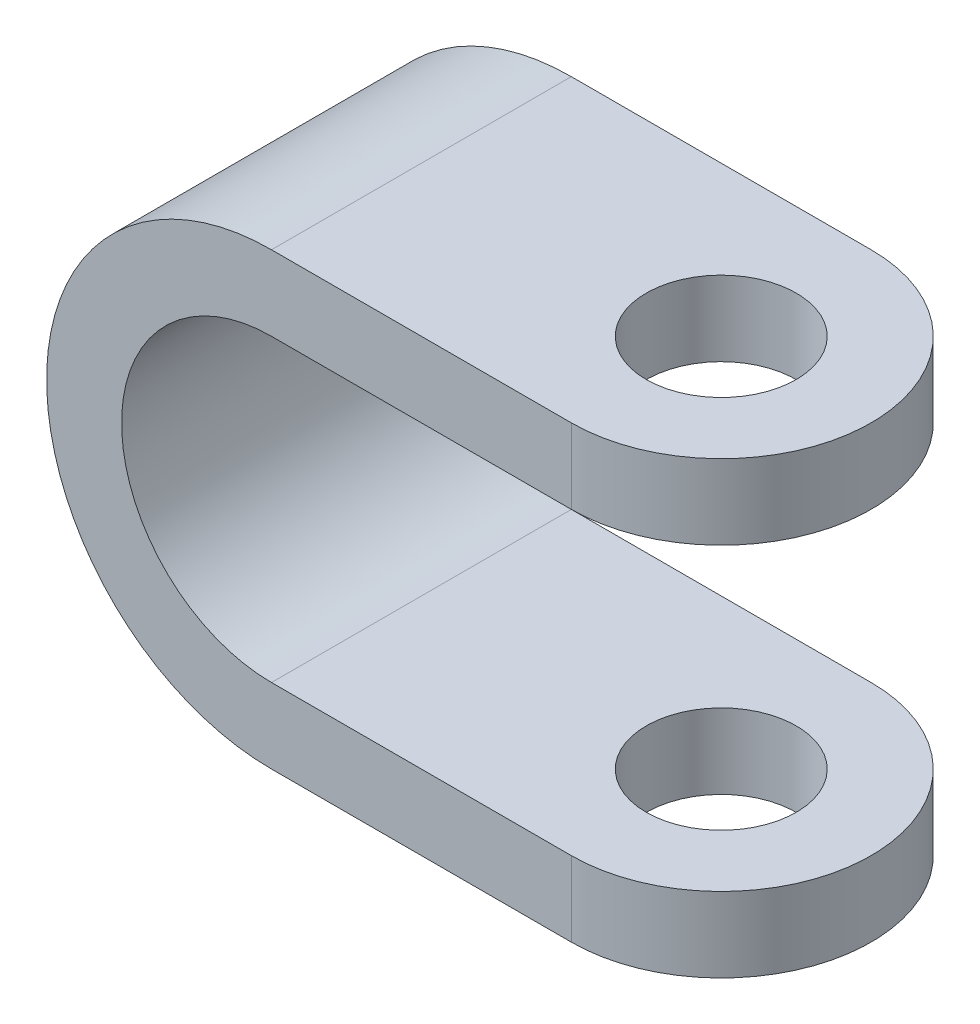
ISO-10303-21;
HEADER;
FILE_DESCRIPTION(('STEP AP214'),'2;1');
FILE_NAME('part.step','',(''),(''),'','','');
FILE_SCHEMA(('AUTOMOTIVE_DESIGN { 1 0 10303 214 1 1 1 1 }'));
ENDSEC;
DATA;
#1=APPLICATION_CONTEXT('core data for automotive mechanical design processes');
#2=APPLICATION_PROTOCOL_DEFINITION('international standard','automotive_design',2000,#1);
#3=PRODUCT_CONTEXT('',#1,'mechanical');
#4=PRODUCT('Part','Part','',(#3));
#5=PRODUCT_RELATED_PRODUCT_CATEGORY('part','',(#4));
#6=PRODUCT_DEFINITION_FORMATION('','',#4);
#7=PRODUCT_DEFINITION_CONTEXT('part definition',#1,'design');
#8=PRODUCT_DEFINITION('design','',#6,#7);
#9=PRODUCT_DEFINITION_SHAPE('','',#8);
#10=(LENGTH_UNIT() NAMED_UNIT(*) SI_UNIT(.MILLI.,.METRE.));
#11=(NAMED_UNIT(*) PLANE_ANGLE_UNIT() SI_UNIT($,.RADIAN.));
#12=(NAMED_UNIT(*) SI_UNIT($,.STERADIAN.) SOLID_ANGLE_UNIT());
#13=UNCERTAINTY_MEASURE_WITH_UNIT(LENGTH_MEASURE(1.E-05),#10,'distance_accuracy_value','');
#14=(GEOMETRIC_REPRESENTATION_CONTEXT(3) GLOBAL_UNCERTAINTY_ASSIGNED_CONTEXT((#13)) GLOBAL_UNIT_ASSIGNED_CONTEXT((#10,
#11,#12)) REPRESENTATION_CONTEXT('',''));
#15=CARTESIAN_POINT('',(0.,0.,0.));
#16=DIRECTION('',(0.,0.,1.));
#17=DIRECTION('',(1.,0.,0.));
#18=AXIS2_PLACEMENT_3D('',#15,#16,#17);
#19=CARTESIAN_POINT('',(-20.,-90.,45.));
#20=DIRECTION('',(0.,1.,0.));
#21=DIRECTION('',(0.,0.,1.));
#22=AXIS2_PLACEMENT_3D('',#19,#20,#21);
#23=CYLINDRICAL_SURFACE('',#22,10.);
#24=CARTESIAN_POINT('',(-20.,-15.,45.));
#25=DIRECTION('',(0.,-1.,0.));
#26=DIRECTION('',(1.,0.,0.));
#27=AXIS2_PLACEMENT_3D('',#24,#25,#26);
#28=CIRCLE('',#27,10.);
#29=CARTESIAN_POINT('',(-20.,-15.,55.));
#30=VERTEX_POINT('',#29);
#31=EDGE_CURVE('E178',#30,#30,#28,.F.);
#32=CARTESIAN_POINT('',(-20.,-5.00000000000002,45.));
#33=DIRECTION('',(0.,-1.,0.));
#34=DIRECTION('',(1.,0.,0.));
#35=AXIS2_PLACEMENT_3D('',#32,#33,#34);
#36=CIRCLE('',#35,10.);
#37=CARTESIAN_POINT('',(-20.,-5.00000000000002,55.));
#38=VERTEX_POINT('',#37);
#39=EDGE_CURVE('E118',#38,#38,#36,.F.);
#40=CARTESIAN_POINT('',(-20.,-15.,55.));
#41=CARTESIAN_POINT('',(-20.,-14.8958333333333,55.));
#42=CARTESIAN_POINT('',(-20.,-14.7916666666667,55.));
#43=CARTESIAN_POINT('',(-20.,-14.5833333333333,55.));
#44=CARTESIAN_POINT('',(-20.,-14.4791666666667,55.));
#45=CARTESIAN_POINT('',(-20.,-14.2708333333333,55.));
#46=CARTESIAN_POINT('',(-20.,-14.1666666666667,55.));
#47=CARTESIAN_POINT('',(-20.,-13.9583333333333,55.));
#48=CARTESIAN_POINT('',(-20.,-13.8541666666667,55.));
#49=CARTESIAN_POINT('',(-20.,-13.6458333333333,55.));
#50=CARTESIAN_POINT('',(-20.,-13.5416666666667,55.));
#51=CARTESIAN_POINT('',(-20.,-13.3333333333333,55.));
#52=CARTESIAN_POINT('',(-20.,-13.2291666666667,55.));
#53=CARTESIAN_POINT('',(-20.,-13.0208333333333,55.));
#54=CARTESIAN_POINT('',(-20.,-12.9166666666667,55.));
#55=CARTESIAN_POINT('',(-20.,-12.7083333333333,55.));
#56=CARTESIAN_POINT('',(-20.,-12.6041666666667,55.));
#57=CARTESIAN_POINT('',(-20.,-12.3958333333333,55.));
#58=CARTESIAN_POINT('',(-20.,-12.2916666666667,55.));
#59=CARTESIAN_POINT('',(-20.,-12.0833333333333,55.));
#60=CARTESIAN_POINT('',(-20.,-11.9791666666667,55.));
#61=CARTESIAN_POINT('',(-20.,-11.7708333333333,55.));
#62=CARTESIAN_POINT('',(-20.,-11.6666666666667,55.));
#63=CARTESIAN_POINT('',(-20.,-11.4583333333333,55.));
#64=CARTESIAN_POINT('',(-20.,-11.3541666666667,55.));
#65=CARTESIAN_POINT('',(-20.,-11.1458333333333,55.));
#66=CARTESIAN_POINT('',(-20.,-11.0416666666667,55.));
#67=CARTESIAN_POINT('',(-20.,-10.8333333333333,55.));
#68=CARTESIAN_POINT('',(-20.,-10.7291666666667,55.));
#69=CARTESIAN_POINT('',(-20.,-10.5208333333333,55.));
#70=CARTESIAN_POINT('',(-20.,-10.4166666666667,55.));
#71=CARTESIAN_POINT('',(-20.,-10.2083333333333,55.));
#72=CARTESIAN_POINT('',(-20.,-10.1041666666667,55.));
#73=CARTESIAN_POINT('',(-20.,-9.89583333333334,55.));
#74=CARTESIAN_POINT('',(-20.,-9.79166666666668,55.));
#75=CARTESIAN_POINT('',(-20.,-9.58333333333335,55.));
#76=CARTESIAN_POINT('',(-20.,-9.47916666666668,55.));
#77=CARTESIAN_POINT('',(-20.,-9.27083333333334,55.));
#78=CARTESIAN_POINT('',(-20.,-9.16666666666668,55.));
#79=CARTESIAN_POINT('',(-20.,-8.95833333333335,55.));
#80=CARTESIAN_POINT('',(-20.,-8.85416666666668,55.));
#81=CARTESIAN_POINT('',(-20.,-8.64583333333334,55.));
#82=CARTESIAN_POINT('',(-20.,-8.54166666666668,55.));
#83=CARTESIAN_POINT('',(-20.,-8.33333333333334,55.));
#84=CARTESIAN_POINT('',(-20.,-8.22916666666668,55.));
#85=CARTESIAN_POINT('',(-20.,-8.02083333333334,55.));
#86=CARTESIAN_POINT('',(-20.,-7.91666666666668,55.));
#87=CARTESIAN_POINT('',(-20.,-7.70833333333335,55.));
#88=CARTESIAN_POINT('',(-20.,-7.60416666666669,55.));
#89=CARTESIAN_POINT('',(-20.,-7.39583333333335,55.));
#90=CARTESIAN_POINT('',(-20.,-7.29166666666668,55.));
#91=CARTESIAN_POINT('',(-20.,-7.08333333333335,55.));
#92=CARTESIAN_POINT('',(-20.,-6.97916666666668,55.));
#93=CARTESIAN_POINT('',(-20.,-6.77083333333335,55.));
#94=CARTESIAN_POINT('',(-20.,-6.66666666666668,55.));
#95=CARTESIAN_POINT('',(-20.,-6.45833333333335,55.));
#96=CARTESIAN_POINT('',(-20.,-6.35416666666668,55.));
#97=CARTESIAN_POINT('',(-20.,-6.14583333333335,55.));
#98=CARTESIAN_POINT('',(-20.,-6.04166666666668,55.));
#99=CARTESIAN_POINT('',(-20.,-5.83333333333335,55.));
#100=CARTESIAN_POINT('',(-20.,-5.72916666666668,55.));
#101=CARTESIAN_POINT('',(-20.,-5.52083333333335,55.));
#102=CARTESIAN_POINT('',(-20.,-5.41666666666668,55.));
#103=CARTESIAN_POINT('',(-20.,-5.20833333333335,55.));
#104=CARTESIAN_POINT('',(-20.,-5.10416666666668,55.));
#105=CARTESIAN_POINT('',(-20.,-5.00000000000002,55.));
#106=B_SPLINE_CURVE_WITH_KNOTS('',3,(#40,#41,#42,#43,#44,#45,#46,#47,#48,#49,#50,#51,#52,#53,
#54,#55,#56,#57,#58,#59,#60,#61,#62,#63,#64,#65,#66,#67,#68,#69,#70,#71,#72,#73,#74,#75,#76,#77,
#78,#79,#80,#81,#82,#83,#84,#85,#86,#87,#88,#89,#90,#91,#92,#93,#94,#95,#96,#97,#98,#99,#100,
#101,#102,#103,#104,#105),.UNSPECIFIED.,.F.,.F.,(4,2,2,2,2,2,2,2,2,2,2,2,2,2,2,2,2,2,2,2,2,2,2,
2,2,2,2,2,2,2,2,2,4),(0.,0.312499999999993,0.625000000000001,0.937499999999994,1.25,
1.56249999999999,1.875,2.1875,2.5,2.8125,3.12499999999999,3.4375,3.74999999999999,4.0625,
4.37499999999999,4.6875,4.99999999999999,5.31249999999998,5.62499999999999,5.93749999999998,
6.24999999999999,6.56249999999998,6.87499999999999,7.18749999999999,7.49999999999998,
7.81249999999999,8.12499999999998,8.43749999999999,8.74999999999998,9.06249999999999,
9.37499999999998,9.68749999999999,9.99999999999998),.UNSPECIFIED.);
#107=EDGE_CURVE('BSEAM41',#30,#38,#106,.T.);
#108=ORIENTED_EDGE('',*,*,#31,.F.);
#109=ORIENTED_EDGE('',*,*,#39,.T.);
#110=ORIENTED_EDGE('',*,*,#107,.T.);
#111=ORIENTED_EDGE('',*,*,#107,.F.);
#112=EDGE_LOOP('',(#108,#110,#109,#111));
#113=FACE_BOUND('',#112,.T.);
#114=ADVANCED_FACE('F41',(#113),#23,.F.);
#115=CARTESIAN_POINT('',(0.,-5.,90.));
#116=DIRECTION('',(0.,-1.,0.));
#117=DIRECTION('',(1.,0.,0.));
#118=AXIS2_PLACEMENT_3D('',#115,#116,#117);
#119=PLANE('',#118);
#120=CARTESIAN_POINT('',(-20.,-5.00000000000002,45.));
#121=DIRECTION('',(0.,-1.,0.));
#122=DIRECTION('',(1.,0.,0.));
#123=AXIS2_PLACEMENT_3D('',#120,#121,#122);
#124=CIRCLE('',#123,20.);
#125=CARTESIAN_POINT('',(-20.,-5.00000000000006,65.));
#126=VERTEX_POINT('',#125);
#127=CARTESIAN_POINT('',(-20.,-5.00000000000005,25.));
#128=VERTEX_POINT('',#127);
#129=EDGE_CURVE('E120',#126,#128,#124,.F.);
#130=ORIENTED_EDGE('',*,*,#129,.T.);
#131=DIRECTION('',(-1.,0.,0.));
#132=VECTOR('',#131,1.);
#133=CARTESIAN_POINT('',(-90.,-5.00000000000003,25.));
#134=LINE('',#133,#132);
#135=CARTESIAN_POINT('',(-60.,-5.,25.));
#136=VERTEX_POINT('',#135);
#137=EDGE_CURVE('E129',#128,#136,#134,.T.);
#138=ORIENTED_EDGE('',*,*,#137,.T.);
#139=DIRECTION('',(0.,0.,-1.));
#140=VECTOR('',#139,1.);
#141=CARTESIAN_POINT('',(-60.,-5.,90.));
#142=LINE('',#141,#140);
#143=CARTESIAN_POINT('',(-60.,-5.,65.));
#144=VERTEX_POINT('',#143);
#145=EDGE_CURVE('E125',#144,#136,#142,.T.);
#146=ORIENTED_EDGE('',*,*,#145,.F.);
#147=DIRECTION('',(1.,0.,0.));
#148=VECTOR('',#147,1.);
#149=CARTESIAN_POINT('',(-90.,-5.00000000000003,65.));
#150=LINE('',#149,#148);
#151=EDGE_CURVE('E104',#144,#126,#150,.T.);
#152=ORIENTED_EDGE('',*,*,#151,.T.);
#153=EDGE_LOOP('',(#130,#138,#146,#152));
#154=FACE_BOUND('',#153,.T.);
#155=ORIENTED_EDGE('',*,*,#39,.F.);
#156=EDGE_LOOP('',(#155));
#157=FACE_BOUND('',#156,.T.);
#158=ADVANCED_FACE('F130',(#154,#157),#119,.F.);
#159=CARTESIAN_POINT('',(-60.,-35.,90.));
#160=DIRECTION('',(0.,0.,-1.));
#161=DIRECTION('',(-1.,0.,0.));
#162=AXIS2_PLACEMENT_3D('',#159,#160,#161);
#163=CYLINDRICAL_SURFACE('',#162,30.);
#164=ORIENTED_EDGE('',*,*,#145,.T.);
#165=CARTESIAN_POINT('',(-60.,-35.,25.));
#166=DIRECTION('',(0.,0.,-1.));
#167=DIRECTION('',(-1.,0.,0.));
#168=AXIS2_PLACEMENT_3D('',#165,#166,#167);
#169=CIRCLE('',#168,30.);
#170=CARTESIAN_POINT('',(-60.,-65.,25.));
#171=VERTEX_POINT('',#170);
#172=EDGE_CURVE('E57',#136,#171,#169,.F.);
#173=ORIENTED_EDGE('',*,*,#172,.T.);
#174=DIRECTION('',(0.,0.,-1.));
#175=VECTOR('',#174,1.);
#176=CARTESIAN_POINT('',(-60.,-65.,90.));
#177=LINE('',#176,#175);
#178=CARTESIAN_POINT('',(-60.,-65.,65.));
#179=VERTEX_POINT('',#178);
#180=EDGE_CURVE('E122',#179,#171,#177,.T.);
#181=ORIENTED_EDGE('',*,*,#180,.F.);
#182=CARTESIAN_POINT('',(-60.,-35.,65.));
#183=DIRECTION('',(0.,0.,1.));
#184=DIRECTION('',(1.,0.,0.));
#185=AXIS2_PLACEMENT_3D('',#182,#183,#184);
#186=CIRCLE('',#185,30.);
#187=EDGE_CURVE('E109',#179,#144,#186,.F.);
#188=ORIENTED_EDGE('',*,*,#187,.T.);
#189=EDGE_LOOP('',(#164,#173,#181,#188));
#190=FACE_BOUND('',#189,.T.);
#191=ADVANCED_FACE('F123',(#190),#163,.T.);
#192=CARTESIAN_POINT('',(-60.,-65.,90.));
#193=DIRECTION('',(0.,1.,0.));
#194=DIRECTION('',(0.,0.,1.));
#195=AXIS2_PLACEMENT_3D('',#192,#193,#194);
#196=PLANE('',#195);
#197=ORIENTED_EDGE('',*,*,#180,.T.);
#198=DIRECTION('',(1.,0.,0.));
#199=VECTOR('',#198,1.);
#200=CARTESIAN_POINT('',(-90.,-65.,25.));
#201=LINE('',#200,#199);
#202=CARTESIAN_POINT('',(-20.,-65.,25.));
#203=VERTEX_POINT('',#202);
#204=EDGE_CURVE('E124',#171,#203,#201,.T.);
#205=ORIENTED_EDGE('',*,*,#204,.T.);
#206=CARTESIAN_POINT('',(-20.,-65.,45.));
#207=DIRECTION('',(0.,1.,0.));
#208=DIRECTION('',(0.,0.,1.));
#209=AXIS2_PLACEMENT_3D('',#206,#207,#208);
#210=CIRCLE('',#209,20.);
#211=CARTESIAN_POINT('',(-20.,-65.,65.));
#212=VERTEX_POINT('',#211);
#213=EDGE_CURVE('E159',#203,#212,#210,.F.);
#214=ORIENTED_EDGE('',*,*,#213,.T.);
#215=DIRECTION('',(-1.,0.,0.));
#216=VECTOR('',#215,1.);
#217=CARTESIAN_POINT('',(-90.,-65.,65.));
#218=LINE('',#217,#216);
#219=EDGE_CURVE('E158',#212,#179,#218,.T.);
#220=ORIENTED_EDGE('',*,*,#219,.T.);
#221=EDGE_LOOP('',(#197,#205,#214,#220));
#222=FACE_BOUND('',#221,.T.);
#223=CARTESIAN_POINT('',(-20.,-65.,45.));
#224=DIRECTION('',(0.,1.,0.));
#225=DIRECTION('',(0.,0.,1.));
#226=AXIS2_PLACEMENT_3D('',#223,#224,#225);
#227=CIRCLE('',#226,10.);
#228=CARTESIAN_POINT('',(-20.,-65.,55.));
#229=VERTEX_POINT('',#228);
#230=EDGE_CURVE('E160',#229,#229,#227,.F.);
#231=ORIENTED_EDGE('',*,*,#230,.F.);
#232=EDGE_LOOP('',(#231));
#233=FACE_BOUND('',#232,.T.);
#234=ADVANCED_FACE('F183',(#222,#233),#196,.F.);
#235=CARTESIAN_POINT('',(-60.,-55.,90.));
#236=DIRECTION('',(0.,1.,0.));
#237=DIRECTION('',(0.,0.,1.));
#238=AXIS2_PLACEMENT_3D('',#235,#236,#237);
#239=PLANE('',#238);
#240=DIRECTION('',(1.,0.,0.));
#241=VECTOR('',#240,1.);
#242=CARTESIAN_POINT('',(-90.,-55.,25.));
#243=LINE('',#242,#241);
#244=CARTESIAN_POINT('',(-60.,-55.,25.));
#245=VERTEX_POINT('',#244);
#246=CARTESIAN_POINT('',(-20.,-55.,25.));
#247=VERTEX_POINT('',#246);
#248=EDGE_CURVE('E152',#245,#247,#243,.T.);
#249=ORIENTED_EDGE('',*,*,#248,.F.);
#250=DIRECTION('',(0.,0.,-1.));
#251=VECTOR('',#250,1.);
#252=CARTESIAN_POINT('',(-60.,-55.,90.));
#253=LINE('',#252,#251);
#254=CARTESIAN_POINT('',(-60.,-55.,65.));
#255=VERTEX_POINT('',#254);
#256=EDGE_CURVE('E135',#255,#245,#253,.T.);
#257=ORIENTED_EDGE('',*,*,#256,.F.);
#258=DIRECTION('',(-1.,0.,0.));
#259=VECTOR('',#258,1.);
#260=CARTESIAN_POINT('',(-90.,-55.,65.));
#261=LINE('',#260,#259);
#262=CARTESIAN_POINT('',(-20.,-55.,65.));
#263=VERTEX_POINT('',#262);
#264=EDGE_CURVE('E149',#263,#255,#261,.T.);
#265=ORIENTED_EDGE('',*,*,#264,.F.);
#266=CARTESIAN_POINT('',(-20.,-55.,45.));
#267=DIRECTION('',(0.,1.,0.));
#268=DIRECTION('',(0.,0.,1.));
#269=AXIS2_PLACEMENT_3D('',#266,#267,#268);
#270=CIRCLE('',#269,20.);
#271=EDGE_CURVE('E155',#247,#263,#270,.F.);
#272=ORIENTED_EDGE('',*,*,#271,.F.);
#273=EDGE_LOOP('',(#249,#257,#265,#272));
#274=FACE_BOUND('',#273,.T.);
#275=CARTESIAN_POINT('',(-20.,-55.,45.));
#276=DIRECTION('',(0.,1.,0.));
#277=DIRECTION('',(0.,0.,1.));
#278=AXIS2_PLACEMENT_3D('',#275,#276,#277);
#279=CIRCLE('',#278,10.);
#280=CARTESIAN_POINT('',(-20.,-55.,55.));
#281=VERTEX_POINT('',#280);
#282=EDGE_CURVE('E47',#281,#281,#279,.F.);
#283=ORIENTED_EDGE('',*,*,#282,.T.);
#284=EDGE_LOOP('',(#283));
#285=FACE_BOUND('',#284,.T.);
#286=ADVANCED_FACE('F186',(#274,#285),#239,.T.);
#287=CARTESIAN_POINT('',(0.,-15.,90.));
#288=DIRECTION('',(0.,-1.,0.));
#289=DIRECTION('',(1.,0.,0.));
#290=AXIS2_PLACEMENT_3D('',#287,#288,#289);
#291=PLANE('',#290);
#292=DIRECTION('',(-1.,0.,0.));
#293=VECTOR('',#292,1.);
#294=CARTESIAN_POINT('',(-90.,-15.,25.));
#295=LINE('',#294,#293);
#296=CARTESIAN_POINT('',(-20.,-15.,25.));
#297=VERTEX_POINT('',#296);
#298=CARTESIAN_POINT('',(-60.,-15.,25.));
#299=VERTEX_POINT('',#298);
#300=EDGE_CURVE('E148',#297,#299,#295,.T.);
#301=ORIENTED_EDGE('',*,*,#300,.F.);
#302=CARTESIAN_POINT('',(-20.,-15.,45.));
#303=DIRECTION('',(0.,-1.,0.));
#304=DIRECTION('',(1.,0.,0.));
#305=AXIS2_PLACEMENT_3D('',#302,#303,#304);
#306=CIRCLE('',#305,20.);
#307=CARTESIAN_POINT('',(-20.,-15.,65.));
#308=VERTEX_POINT('',#307);
#309=EDGE_CURVE('E141',#308,#297,#306,.F.);
#310=ORIENTED_EDGE('',*,*,#309,.F.);
#311=DIRECTION('',(1.,0.,0.));
#312=VECTOR('',#311,1.);
#313=CARTESIAN_POINT('',(-90.,-15.,65.));
#314=LINE('',#313,#312);
#315=CARTESIAN_POINT('',(-60.,-15.,65.));
#316=VERTEX_POINT('',#315);
#317=EDGE_CURVE('E143',#316,#308,#314,.T.);
#318=ORIENTED_EDGE('',*,*,#317,.F.);
#319=DIRECTION('',(0.,0.,-1.));
#320=VECTOR('',#319,1.);
#321=CARTESIAN_POINT('',(-60.,-15.,90.));
#322=LINE('',#321,#320);
#323=EDGE_CURVE('E128',#316,#299,#322,.T.);
#324=ORIENTED_EDGE('',*,*,#323,.T.);
#325=EDGE_LOOP('',(#301,#310,#318,#324));
#326=FACE_BOUND('',#325,.T.);
#327=ORIENTED_EDGE('',*,*,#31,.T.);
#328=EDGE_LOOP('',(#327));
#329=FACE_BOUND('',#328,.T.);
#330=ADVANCED_FACE('F191',(#326,#329),#291,.T.);
#331=CARTESIAN_POINT('',(-60.,-35.,90.));
#332=DIRECTION('',(0.,0.,-1.));
#333=DIRECTION('',(-1.,0.,0.));
#334=AXIS2_PLACEMENT_3D('',#331,#332,#333);
#335=CYLINDRICAL_SURFACE('',#334,20.);
#336=CARTESIAN_POINT('',(-60.,-35.,25.));
#337=DIRECTION('',(0.,0.,-1.));
#338=DIRECTION('',(-1.,0.,0.));
#339=AXIS2_PLACEMENT_3D('',#336,#337,#338);
#340=CIRCLE('',#339,20.);
#341=EDGE_CURVE('E164',#299,#245,#340,.F.);
#342=ORIENTED_EDGE('',*,*,#341,.F.);
#343=ORIENTED_EDGE('',*,*,#323,.F.);
#344=CARTESIAN_POINT('',(-60.,-35.,65.));
#345=DIRECTION('',(0.,0.,1.));
#346=DIRECTION('',(1.,0.,0.));
#347=AXIS2_PLACEMENT_3D('',#344,#345,#346);
#348=CIRCLE('',#347,20.);
#349=EDGE_CURVE('E11',#255,#316,#348,.F.);
#350=ORIENTED_EDGE('',*,*,#349,.F.);
#351=ORIENTED_EDGE('',*,*,#256,.T.);
#352=EDGE_LOOP('',(#342,#343,#350,#351));
#353=FACE_BOUND('',#352,.T.);
#354=ADVANCED_FACE('F210',(#353),#335,.F.);
#355=CARTESIAN_POINT('',(-20.,-55.,55.));
#356=CARTESIAN_POINT('',(-20.,-55.1041666666667,55.));
#357=CARTESIAN_POINT('',(-20.,-55.2083333333333,55.));
#358=CARTESIAN_POINT('',(-20.,-55.4166666666667,55.));
#359=CARTESIAN_POINT('',(-20.,-55.5208333333333,55.));
#360=CARTESIAN_POINT('',(-20.,-55.7291666666667,55.));
#361=CARTESIAN_POINT('',(-20.,-55.8333333333333,55.));
#362=CARTESIAN_POINT('',(-20.,-56.0416666666667,55.));
#363=CARTESIAN_POINT('',(-20.,-56.1458333333333,55.));
#364=CARTESIAN_POINT('',(-20.,-56.3541666666667,55.));
#365=CARTESIAN_POINT('',(-20.,-56.4583333333333,55.));
#366=CARTESIAN_POINT('',(-20.,-56.6666666666667,55.));
#367=CARTESIAN_POINT('',(-20.,-56.7708333333333,55.));
#368=CARTESIAN_POINT('',(-20.,-56.9791666666667,55.));
#369=CARTESIAN_POINT('',(-20.,-57.0833333333333,55.));
#370=CARTESIAN_POINT('',(-20.,-57.2916666666667,55.));
#371=CARTESIAN_POINT('',(-20.,-57.3958333333333,55.));
#372=CARTESIAN_POINT('',(-20.,-57.6041666666667,55.));
#373=CARTESIAN_POINT('',(-20.,-57.7083333333333,55.));
#374=CARTESIAN_POINT('',(-20.,-57.9166666666667,55.));
#375=CARTESIAN_POINT('',(-20.,-58.0208333333333,55.));
#376=CARTESIAN_POINT('',(-20.,-58.2291666666667,55.));
#377=CARTESIAN_POINT('',(-20.,-58.3333333333333,55.));
#378=CARTESIAN_POINT('',(-20.,-58.5416666666667,55.));
#379=CARTESIAN_POINT('',(-20.,-58.6458333333333,55.));
#380=CARTESIAN_POINT('',(-20.,-58.8541666666667,55.));
#381=CARTESIAN_POINT('',(-20.,-58.9583333333333,55.));
#382=CARTESIAN_POINT('',(-20.,-59.1666666666667,55.));
#383=CARTESIAN_POINT('',(-20.,-59.2708333333333,55.));
#384=CARTESIAN_POINT('',(-20.,-59.4791666666667,55.));
#385=CARTESIAN_POINT('',(-20.,-59.5833333333333,55.));
#386=CARTESIAN_POINT('',(-20.,-59.7916666666667,55.));
#387=CARTESIAN_POINT('',(-20.,-59.8958333333333,55.));
#388=CARTESIAN_POINT('',(-20.,-60.1041666666667,55.));
#389=CARTESIAN_POINT('',(-20.,-60.2083333333333,55.));
#390=CARTESIAN_POINT('',(-20.,-60.4166666666667,55.));
#391=CARTESIAN_POINT('',(-20.,-60.5208333333333,55.));
#392=CARTESIAN_POINT('',(-20.,-60.7291666666667,55.));
#393=CARTESIAN_POINT('',(-20.,-60.8333333333333,55.));
#394=CARTESIAN_POINT('',(-20.,-61.0416666666667,55.));
#395=CARTESIAN_POINT('',(-20.,-61.1458333333333,55.));
#396=CARTESIAN_POINT('',(-20.,-61.3541666666667,55.));
#397=CARTESIAN_POINT('',(-20.,-61.4583333333333,55.));
#398=CARTESIAN_POINT('',(-20.,-61.6666666666667,55.));
#399=CARTESIAN_POINT('',(-20.,-61.7708333333333,55.));
#400=CARTESIAN_POINT('',(-20.,-61.9791666666667,55.));
#401=CARTESIAN_POINT('',(-20.,-62.0833333333333,55.));
#402=CARTESIAN_POINT('',(-20.,-62.2916666666667,55.));
#403=CARTESIAN_POINT('',(-20.,-62.3958333333333,55.));
#404=CARTESIAN_POINT('',(-20.,-62.6041666666667,55.));
#405=CARTESIAN_POINT('',(-20.,-62.7083333333333,55.));
#406=CARTESIAN_POINT('',(-20.,-62.9166666666667,55.));
#407=CARTESIAN_POINT('',(-20.,-63.0208333333333,55.));
#408=CARTESIAN_POINT('',(-20.,-63.2291666666667,55.));
#409=CARTESIAN_POINT('',(-20.,-63.3333333333333,55.));
#410=CARTESIAN_POINT('',(-20.,-63.5416666666667,55.));
#411=CARTESIAN_POINT('',(-20.,-63.6458333333333,55.));
#412=CARTESIAN_POINT('',(-20.,-63.8541666666667,55.));
#413=CARTESIAN_POINT('',(-20.,-63.9583333333333,55.));
#414=CARTESIAN_POINT('',(-20.,-64.1666666666667,55.));
#415=CARTESIAN_POINT('',(-20.,-64.2708333333333,55.));
#416=CARTESIAN_POINT('',(-20.,-64.4791666666667,55.));
#417=CARTESIAN_POINT('',(-20.,-64.5833333333333,55.));
#418=CARTESIAN_POINT('',(-20.,-64.7916666666667,55.));
#419=CARTESIAN_POINT('',(-20.,-64.8958333333333,55.));
#420=CARTESIAN_POINT('',(-20.,-65.,55.));
#421=B_SPLINE_CURVE_WITH_KNOTS('',3,(#355,#356,#357,#358,#359,#360,#361,#362,#363,#364,#365,
#366,#367,#368,#369,#370,#371,#372,#373,#374,#375,#376,#377,#378,#379,#380,#381,#382,#383,#384,
#385,#386,#387,#388,#389,#390,#391,#392,#393,#394,#395,#396,#397,#398,#399,#400,#401,#402,#403,
#404,#405,#406,#407,#408,#409,#410,#411,#412,#413,#414,#415,#416,#417,#418,#419,#420),
.UNSPECIFIED.,.F.,.F.,(4,2,2,2,2,2,2,2,2,2,2,2,2,2,2,2,2,2,2,2,2,2,2,2,2,2,2,2,2,2,2,2,4),(0.,
0.3125,0.625000000000001,0.937500000000001,1.25,1.5625,1.875,2.1875,2.5,2.8125,3.125,3.4375,
3.75,4.0625,4.375,4.6875,5.,5.3125,5.625,5.9375,6.25,6.5625,6.875,7.18749999999999,7.5,
7.81249999999999,8.125,8.43749999999999,8.75,9.06249999999999,9.375,9.68749999999999,10.),.UNSPECIFIED.);
#422=EDGE_CURVE('BSEAM181',#281,#229,#421,.T.);
#423=ORIENTED_EDGE('',*,*,#282,.F.);
#424=ORIENTED_EDGE('',*,*,#230,.T.);
#425=ORIENTED_EDGE('',*,*,#422,.T.);
#426=ORIENTED_EDGE('',*,*,#422,.F.);
#427=EDGE_LOOP('',(#423,#425,#424,#426));
#428=FACE_BOUND('',#427,.T.);
#429=ADVANCED_FACE('F181',(#428),#23,.F.);
#430=CARTESIAN_POINT('',(-90.,-90.,25.));
#431=DIRECTION('',(0.,0.,-1.));
#432=DIRECTION('',(-1.,0.,0.));
#433=AXIS2_PLACEMENT_3D('',#430,#431,#432);
#434=PLANE('',#433);
#435=ORIENTED_EDGE('',*,*,#341,.T.);
#436=ORIENTED_EDGE('',*,*,#248,.T.);
#437=DIRECTION('',(0.,1.,0.));
#438=VECTOR('',#437,1.);
#439=CARTESIAN_POINT('',(-20.,-90.,25.));
#440=LINE('',#439,#438);
#441=EDGE_CURVE('E174',#203,#247,#440,.T.);
#442=ORIENTED_EDGE('',*,*,#441,.F.);
#443=ORIENTED_EDGE('',*,*,#204,.F.);
#444=ORIENTED_EDGE('',*,*,#172,.F.);
#445=ORIENTED_EDGE('',*,*,#137,.F.);
#446=EDGE_CURVE('E169',#297,#128,#440,.T.);
#447=ORIENTED_EDGE('',*,*,#446,.F.);
#448=ORIENTED_EDGE('',*,*,#300,.T.);
#449=EDGE_LOOP('',(#435,#436,#442,#443,#444,#445,#447,#448));
#450=FACE_BOUND('',#449,.T.);
#451=ADVANCED_FACE('F43',(#450),#434,.T.);
#452=CARTESIAN_POINT('',(-20.,-90.,45.));
#453=DIRECTION('',(0.,1.,0.));
#454=DIRECTION('',(0.,0.,1.));
#455=AXIS2_PLACEMENT_3D('',#452,#453,#454);
#456=CYLINDRICAL_SURFACE('',#455,20.);
#457=ORIENTED_EDGE('',*,*,#213,.F.);
#458=ORIENTED_EDGE('',*,*,#441,.T.);
#459=ORIENTED_EDGE('',*,*,#271,.T.);
#460=DIRECTION('',(0.,1.,0.));
#461=VECTOR('',#460,1.);
#462=CARTESIAN_POINT('',(-20.,-90.,65.));
#463=LINE('',#462,#461);
#464=EDGE_CURVE('E171',#212,#263,#463,.T.);
#465=ORIENTED_EDGE('',*,*,#464,.F.);
#466=EDGE_LOOP('',(#457,#458,#459,#465));
#467=FACE_BOUND('',#466,.T.);
#468=ADVANCED_FACE('F215',(#467),#456,.T.);
#469=EDGE_CURVE('E111',#308,#126,#463,.T.);
#470=ORIENTED_EDGE('',*,*,#469,.F.);
#471=ORIENTED_EDGE('',*,*,#309,.T.);
#472=ORIENTED_EDGE('',*,*,#446,.T.);
#473=ORIENTED_EDGE('',*,*,#129,.F.);
#474=EDGE_LOOP('',(#470,#471,#472,#473));
#475=FACE_BOUND('',#474,.T.);
#476=ADVANCED_FACE('F229',(#475),#456,.T.);
#477=CARTESIAN_POINT('',(-90.,-90.,65.));
#478=DIRECTION('',(0.,0.,1.));
#479=DIRECTION('',(1.,0.,0.));
#480=AXIS2_PLACEMENT_3D('',#477,#478,#479);
#481=PLANE('',#480);
#482=ORIENTED_EDGE('',*,*,#464,.T.);
#483=ORIENTED_EDGE('',*,*,#264,.T.);
#484=ORIENTED_EDGE('',*,*,#349,.T.);
#485=ORIENTED_EDGE('',*,*,#317,.T.);
#486=ORIENTED_EDGE('',*,*,#469,.T.);
#487=ORIENTED_EDGE('',*,*,#151,.F.);
#488=ORIENTED_EDGE('',*,*,#187,.F.);
#489=ORIENTED_EDGE('',*,*,#219,.F.);
#490=EDGE_LOOP('',(#482,#483,#484,#485,#486,#487,#488,#489));
#491=FACE_BOUND('',#490,.T.);
#492=ADVANCED_FACE('F107',(#491),#481,.T.);
#493=CLOSED_SHELL('',(#114,#158,#191,#234,#286,#330,#354,#429,#451,#468,#476,#492));
#494=MANIFOLD_SOLID_BREP('B2',#493);
#495=ADVANCED_BREP_SHAPE_REPRESENTATION('',(#18,#494),#14);
#496=SHAPE_DEFINITION_REPRESENTATION(#9,#495);
ENDSEC;
END-ISO-10303-21;
